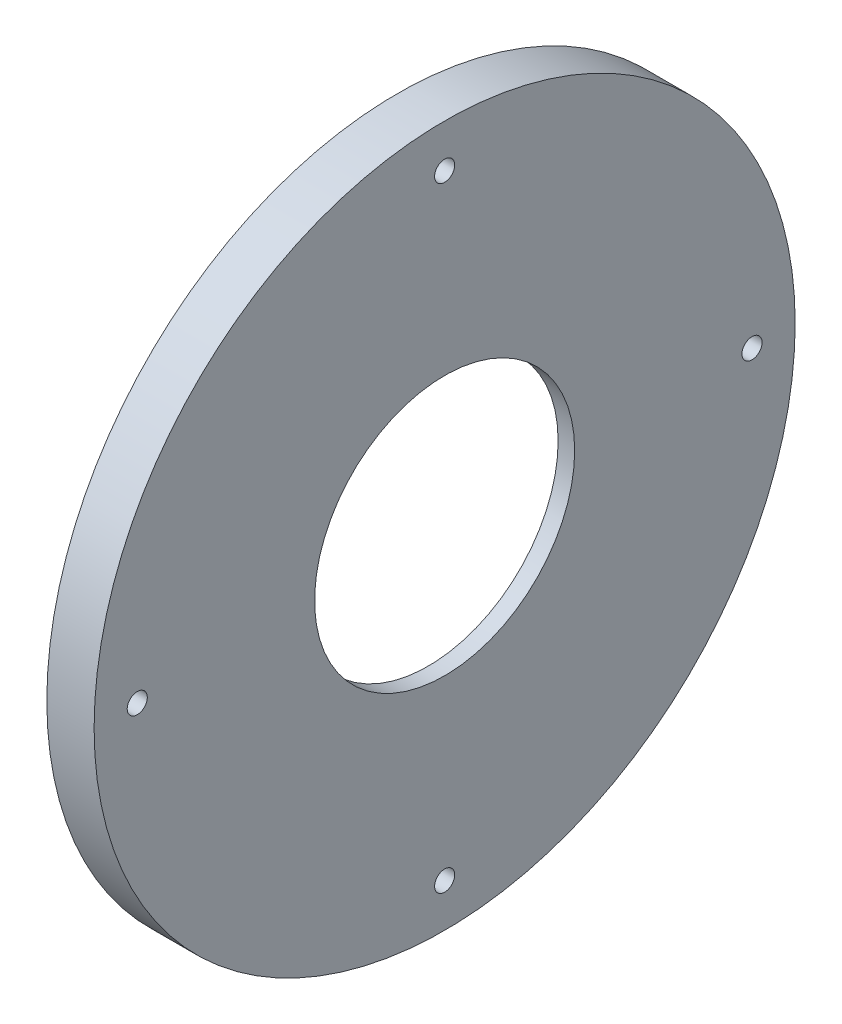
ISO-10303-21;
HEADER;
FILE_DESCRIPTION(('STEP AP214'),'2;1');
FILE_NAME('part.step','',(''),(''),'','','');
FILE_SCHEMA(('AUTOMOTIVE_DESIGN { 1 0 10303 214 1 1 1 1 }'));
ENDSEC;
DATA;
#1=APPLICATION_CONTEXT('core data for automotive mechanical design processes');
#2=APPLICATION_PROTOCOL_DEFINITION('international standard','automotive_design',2000,#1);
#3=PRODUCT_CONTEXT('',#1,'mechanical');
#4=PRODUCT('Part','Part','',(#3));
#5=PRODUCT_RELATED_PRODUCT_CATEGORY('part','',(#4));
#6=PRODUCT_DEFINITION_FORMATION('','',#4);
#7=PRODUCT_DEFINITION_CONTEXT('part definition',#1,'design');
#8=PRODUCT_DEFINITION('design','',#6,#7);
#9=PRODUCT_DEFINITION_SHAPE('','',#8);
#10=(LENGTH_UNIT() NAMED_UNIT(*) SI_UNIT(.MILLI.,.METRE.));
#11=(NAMED_UNIT(*) PLANE_ANGLE_UNIT() SI_UNIT($,.RADIAN.));
#12=(NAMED_UNIT(*) SI_UNIT($,.STERADIAN.) SOLID_ANGLE_UNIT());
#13=UNCERTAINTY_MEASURE_WITH_UNIT(LENGTH_MEASURE(1.E-05),#10,'distance_accuracy_value','');
#14=(GEOMETRIC_REPRESENTATION_CONTEXT(3) GLOBAL_UNCERTAINTY_ASSIGNED_CONTEXT((#13)) GLOBAL_UNIT_ASSIGNED_CONTEXT((#10,
#11,#12)) REPRESENTATION_CONTEXT('',''));
#15=CARTESIAN_POINT('',(0.,0.,0.));
#16=DIRECTION('',(0.,0.,1.));
#17=DIRECTION('',(1.,0.,0.));
#18=AXIS2_PLACEMENT_3D('',#15,#16,#17);
#19=CARTESIAN_POINT('',(387.851746626202,0.,0.));
#20=DIRECTION('',(1.,0.,0.));
#21=DIRECTION('',(0.,0.,-1.));
#22=AXIS2_PLACEMENT_3D('',#19,#20,#21);
#23=CYLINDRICAL_SURFACE('',#22,55.);
#24=CARTESIAN_POINT('',(407.851746626202,0.,0.));
#25=DIRECTION('',(1.,0.,0.));
#26=DIRECTION('',(0.,0.,-1.));
#27=AXIS2_PLACEMENT_3D('',#24,#25,#26);
#28=CIRCLE('',#27,55.);
#29=CARTESIAN_POINT('',(407.851746626202,0.,-55.));
#30=VERTEX_POINT('',#29);
#31=EDGE_CURVE('E57',#30,#30,#28,.T.);
#32=ORIENTED_EDGE('',*,*,#31,.T.);
#33=EDGE_LOOP('',(#32));
#34=FACE_BOUND('',#33,.T.);
#35=CARTESIAN_POINT('',(400.851746626202,0.,0.));
#36=DIRECTION('',(-1.,0.,0.));
#37=DIRECTION('',(0.,0.,1.));
#38=AXIS2_PLACEMENT_3D('',#35,#36,#37);
#39=CIRCLE('',#38,55.);
#40=CARTESIAN_POINT('',(400.851746626202,0.,55.));
#41=VERTEX_POINT('',#40);
#42=EDGE_CURVE('E47',#41,#41,#39,.F.);
#43=ORIENTED_EDGE('',*,*,#42,.F.);
#44=EDGE_LOOP('',(#43));
#45=FACE_BOUND('',#44,.T.);
#46=ADVANCED_FACE('F43',(#34,#45),#23,.F.);
#47=CARTESIAN_POINT('',(22.6723846157029,0.,0.));
#48=DIRECTION('',(-1.,0.,0.));
#49=DIRECTION('',(0.,0.,1.));
#50=AXIS2_PLACEMENT_3D('',#47,#48,#49);
#51=CYLINDRICAL_SURFACE('',#50,148.25);
#52=CARTESIAN_POINT('',(387.851746626202,0.,0.));
#53=DIRECTION('',(-1.,0.,0.));
#54=DIRECTION('',(0.,0.,1.));
#55=AXIS2_PLACEMENT_3D('',#52,#53,#54);
#56=CIRCLE('',#55,148.25);
#57=CARTESIAN_POINT('',(387.851746626202,0.,148.25));
#58=VERTEX_POINT('',#57);
#59=EDGE_CURVE('E10',#58,#58,#56,.T.);
#60=ORIENTED_EDGE('',*,*,#59,.F.);
#61=EDGE_LOOP('',(#60));
#62=FACE_BOUND('',#61,.T.);
#63=CARTESIAN_POINT('',(407.851746626202,0.,0.));
#64=DIRECTION('',(-1.,0.,0.));
#65=DIRECTION('',(0.,0.,1.));
#66=AXIS2_PLACEMENT_3D('',#63,#64,#65);
#67=CIRCLE('',#66,148.25);
#68=CARTESIAN_POINT('',(407.851746626202,0.,148.25));
#69=VERTEX_POINT('',#68);
#70=EDGE_CURVE('E52',#69,#69,#67,.T.);
#71=ORIENTED_EDGE('',*,*,#70,.T.);
#72=EDGE_LOOP('',(#71));
#73=FACE_BOUND('',#72,.T.);
#74=ADVANCED_FACE('F45',(#62,#73),#51,.T.);
#75=CARTESIAN_POINT('',(387.851746626202,1.45228310032206E-13,0.));
#76=DIRECTION('',(1.,0.,0.));
#77=DIRECTION('',(0.,0.,-1.));
#78=AXIS2_PLACEMENT_3D('',#75,#76,#77);
#79=PLANE('',#78);
#80=CARTESIAN_POINT('',(387.851746626202,130.,0.));
#81=DIRECTION('',(-1.,0.,0.));
#82=DIRECTION('',(0.,0.,1.));
#83=AXIS2_PLACEMENT_3D('',#80,#81,#82);
#84=CIRCLE('',#83,4.24999999999998);
#85=CARTESIAN_POINT('',(387.851746626202,130.,4.24999999999998));
#86=VERTEX_POINT('',#85);
#87=EDGE_CURVE('E99',#86,#86,#84,.T.);
#88=ORIENTED_EDGE('',*,*,#87,.F.);
#89=EDGE_LOOP('',(#88));
#90=FACE_BOUND('',#89,.T.);
#91=CARTESIAN_POINT('',(387.851746626202,0.,-130.));
#92=DIRECTION('',(-1.,0.,0.));
#93=DIRECTION('',(0.,0.,1.));
#94=AXIS2_PLACEMENT_3D('',#91,#92,#93);
#95=CIRCLE('',#94,4.24999999999999);
#96=CARTESIAN_POINT('',(387.851746626202,0.,-125.75));
#97=VERTEX_POINT('',#96);
#98=EDGE_CURVE('E91',#97,#97,#95,.T.);
#99=ORIENTED_EDGE('',*,*,#98,.F.);
#100=EDGE_LOOP('',(#99));
#101=FACE_BOUND('',#100,.T.);
#102=CARTESIAN_POINT('',(387.851746626202,-130.,0.));
#103=DIRECTION('',(-1.,0.,0.));
#104=DIRECTION('',(0.,0.,1.));
#105=AXIS2_PLACEMENT_3D('',#102,#103,#104);
#106=CIRCLE('',#105,4.24999999999998);
#107=CARTESIAN_POINT('',(387.851746626202,-130.,4.24999999999998));
#108=VERTEX_POINT('',#107);
#109=EDGE_CURVE('E83',#108,#108,#106,.T.);
#110=ORIENTED_EDGE('',*,*,#109,.F.);
#111=EDGE_LOOP('',(#110));
#112=FACE_BOUND('',#111,.T.);
#113=CARTESIAN_POINT('',(387.851746626202,0.,130.));
#114=DIRECTION('',(-1.,0.,0.));
#115=DIRECTION('',(0.,0.,1.));
#116=AXIS2_PLACEMENT_3D('',#113,#114,#115);
#117=CIRCLE('',#116,4.24999999999999);
#118=CARTESIAN_POINT('',(387.851746626202,0.,134.25));
#119=VERTEX_POINT('',#118);
#120=EDGE_CURVE('E75',#119,#119,#117,.T.);
#121=ORIENTED_EDGE('',*,*,#120,.F.);
#122=EDGE_LOOP('',(#121));
#123=FACE_BOUND('',#122,.T.);
#124=CARTESIAN_POINT('',(387.851746626202,0.,0.));
#125=DIRECTION('',(-1.,0.,0.));
#126=DIRECTION('',(0.,0.,1.));
#127=AXIS2_PLACEMENT_3D('',#124,#125,#126);
#128=CIRCLE('',#127,87.637601459645);
#129=CARTESIAN_POINT('',(387.851746626202,0.,87.637601459645));
#130=VERTEX_POINT('',#129);
#131=EDGE_CURVE('E63',#130,#130,#128,.T.);
#132=ORIENTED_EDGE('',*,*,#131,.F.);
#133=EDGE_LOOP('',(#132));
#134=FACE_BOUND('',#133,.T.);
#135=ORIENTED_EDGE('',*,*,#59,.T.);
#136=EDGE_LOOP('',(#135));
#137=FACE_BOUND('',#136,.T.);
#138=ADVANCED_FACE('F106',(#90,#101,#112,#123,#134,#137),#79,.F.);
#139=CARTESIAN_POINT('',(407.851746626202,0.,0.));
#140=DIRECTION('',(-1.,0.,0.));
#141=DIRECTION('',(0.,0.,1.));
#142=AXIS2_PLACEMENT_3D('',#139,#140,#141);
#143=PLANE('',#142);
#144=CARTESIAN_POINT('',(407.851746626202,130.,0.));
#145=DIRECTION('',(-1.,0.,0.));
#146=DIRECTION('',(0.,0.,1.));
#147=AXIS2_PLACEMENT_3D('',#144,#145,#146);
#148=CIRCLE('',#147,4.25);
#149=CARTESIAN_POINT('',(407.851746626202,130.,4.25));
#150=VERTEX_POINT('',#149);
#151=EDGE_CURVE('E95',#150,#150,#148,.T.);
#152=ORIENTED_EDGE('',*,*,#151,.T.);
#153=EDGE_LOOP('',(#152));
#154=FACE_BOUND('',#153,.T.);
#155=CARTESIAN_POINT('',(407.851746626202,0.,-130.));
#156=DIRECTION('',(-1.,0.,0.));
#157=DIRECTION('',(0.,0.,1.));
#158=AXIS2_PLACEMENT_3D('',#155,#156,#157);
#159=CIRCLE('',#158,4.24999999999999);
#160=CARTESIAN_POINT('',(407.851746626202,0.,-125.75));
#161=VERTEX_POINT('',#160);
#162=EDGE_CURVE('E87',#161,#161,#159,.T.);
#163=ORIENTED_EDGE('',*,*,#162,.T.);
#164=EDGE_LOOP('',(#163));
#165=FACE_BOUND('',#164,.T.);
#166=CARTESIAN_POINT('',(407.851746626202,-130.,0.));
#167=DIRECTION('',(-1.,0.,0.));
#168=DIRECTION('',(0.,0.,1.));
#169=AXIS2_PLACEMENT_3D('',#166,#167,#168);
#170=CIRCLE('',#169,4.25);
#171=CARTESIAN_POINT('',(407.851746626202,-130.,4.25));
#172=VERTEX_POINT('',#171);
#173=EDGE_CURVE('E79',#172,#172,#170,.T.);
#174=ORIENTED_EDGE('',*,*,#173,.T.);
#175=EDGE_LOOP('',(#174));
#176=FACE_BOUND('',#175,.T.);
#177=CARTESIAN_POINT('',(407.851746626202,0.,130.));
#178=DIRECTION('',(-1.,0.,0.));
#179=DIRECTION('',(0.,0.,1.));
#180=AXIS2_PLACEMENT_3D('',#177,#178,#179);
#181=CIRCLE('',#180,4.24999999999999);
#182=CARTESIAN_POINT('',(407.851746626202,0.,134.25));
#183=VERTEX_POINT('',#182);
#184=EDGE_CURVE('E68',#183,#183,#181,.T.);
#185=ORIENTED_EDGE('',*,*,#184,.T.);
#186=EDGE_LOOP('',(#185));
#187=FACE_BOUND('',#186,.T.);
#188=ORIENTED_EDGE('',*,*,#31,.F.);
#189=EDGE_LOOP('',(#188));
#190=FACE_BOUND('',#189,.T.);
#191=ORIENTED_EDGE('',*,*,#70,.F.);
#192=EDGE_LOOP('',(#191));
#193=FACE_BOUND('',#192,.T.);
#194=ADVANCED_FACE('F109',(#154,#165,#176,#187,#190,#193),#143,.F.);
#195=CARTESIAN_POINT('',(400.851746626202,0.,0.));
#196=DIRECTION('',(-1.,0.,0.));
#197=DIRECTION('',(0.,0.,1.));
#198=AXIS2_PLACEMENT_3D('',#195,#196,#197);
#199=PLANE('',#198);
#200=CARTESIAN_POINT('',(400.851746626202,0.,0.));
#201=DIRECTION('',(-1.,0.,0.));
#202=DIRECTION('',(0.,0.,1.));
#203=AXIS2_PLACEMENT_3D('',#200,#201,#202);
#204=CIRCLE('',#203,87.637601459645);
#205=CARTESIAN_POINT('',(400.851746626202,0.,87.637601459645));
#206=VERTEX_POINT('',#205);
#207=EDGE_CURVE('E67',#206,#206,#204,.T.);
#208=ORIENTED_EDGE('',*,*,#207,.T.);
#209=EDGE_LOOP('',(#208));
#210=FACE_BOUND('',#209,.T.);
#211=ORIENTED_EDGE('',*,*,#42,.T.);
#212=EDGE_LOOP('',(#211));
#213=FACE_BOUND('',#212,.T.);
#214=ADVANCED_FACE('F121',(#210,#213),#199,.T.);
#215=CARTESIAN_POINT('',(400.851746626202,0.,0.));
#216=DIRECTION('',(-1.,0.,0.));
#217=DIRECTION('',(0.,0.,1.));
#218=AXIS2_PLACEMENT_3D('',#215,#216,#217);
#219=CYLINDRICAL_SURFACE('',#218,87.637601459645);
#220=CARTESIAN_POINT('',(400.851746626202,0.,87.637601459645));
#221=CARTESIAN_POINT('',(400.716329959536,0.,87.637601459645));
#222=CARTESIAN_POINT('',(400.580913292869,0.,87.637601459645));
#223=CARTESIAN_POINT('',(400.310079959536,0.,87.637601459645));
#224=CARTESIAN_POINT('',(400.174663292869,0.,87.637601459645));
#225=CARTESIAN_POINT('',(399.903829959536,0.,87.637601459645));
#226=CARTESIAN_POINT('',(399.768413292869,0.,87.637601459645));
#227=CARTESIAN_POINT('',(399.497579959536,0.,87.637601459645));
#228=CARTESIAN_POINT('',(399.362163292869,0.,87.637601459645));
#229=CARTESIAN_POINT('',(399.091329959536,0.,87.637601459645));
#230=CARTESIAN_POINT('',(398.955913292869,0.,87.637601459645));
#231=CARTESIAN_POINT('',(398.685079959536,0.,87.637601459645));
#232=CARTESIAN_POINT('',(398.549663292869,0.,87.637601459645));
#233=CARTESIAN_POINT('',(398.278829959536,0.,87.637601459645));
#234=CARTESIAN_POINT('',(398.143413292869,0.,87.637601459645));
#235=CARTESIAN_POINT('',(397.872579959536,0.,87.637601459645));
#236=CARTESIAN_POINT('',(397.737163292869,0.,87.637601459645));
#237=CARTESIAN_POINT('',(397.466329959536,0.,87.637601459645));
#238=CARTESIAN_POINT('',(397.330913292869,0.,87.637601459645));
#239=CARTESIAN_POINT('',(397.060079959536,0.,87.637601459645));
#240=CARTESIAN_POINT('',(396.924663292869,0.,87.637601459645));
#241=CARTESIAN_POINT('',(396.653829959536,0.,87.637601459645));
#242=CARTESIAN_POINT('',(396.518413292869,0.,87.637601459645));
#243=CARTESIAN_POINT('',(396.247579959536,0.,87.637601459645));
#244=CARTESIAN_POINT('',(396.112163292869,0.,87.637601459645));
#245=CARTESIAN_POINT('',(395.841329959536,0.,87.637601459645));
#246=CARTESIAN_POINT('',(395.705913292869,0.,87.637601459645));
#247=CARTESIAN_POINT('',(395.435079959536,0.,87.637601459645));
#248=CARTESIAN_POINT('',(395.299663292869,0.,87.637601459645));
#249=CARTESIAN_POINT('',(395.028829959536,0.,87.637601459645));
#250=CARTESIAN_POINT('',(394.893413292869,0.,87.637601459645));
#251=CARTESIAN_POINT('',(394.622579959536,0.,87.637601459645));
#252=CARTESIAN_POINT('',(394.487163292869,0.,87.637601459645));
#253=CARTESIAN_POINT('',(394.216329959536,0.,87.637601459645));
#254=CARTESIAN_POINT('',(394.080913292869,0.,87.637601459645));
#255=CARTESIAN_POINT('',(393.810079959536,0.,87.637601459645));
#256=CARTESIAN_POINT('',(393.674663292869,0.,87.637601459645));
#257=CARTESIAN_POINT('',(393.403829959536,0.,87.637601459645));
#258=CARTESIAN_POINT('',(393.268413292869,0.,87.637601459645));
#259=CARTESIAN_POINT('',(392.997579959536,0.,87.637601459645));
#260=CARTESIAN_POINT('',(392.862163292869,0.,87.637601459645));
#261=CARTESIAN_POINT('',(392.591329959536,0.,87.637601459645));
#262=CARTESIAN_POINT('',(392.455913292869,0.,87.637601459645));
#263=CARTESIAN_POINT('',(392.185079959536,0.,87.637601459645));
#264=CARTESIAN_POINT('',(392.049663292869,0.,87.637601459645));
#265=CARTESIAN_POINT('',(391.778829959536,0.,87.637601459645));
#266=CARTESIAN_POINT('',(391.643413292869,0.,87.637601459645));
#267=CARTESIAN_POINT('',(391.372579959536,0.,87.637601459645));
#268=CARTESIAN_POINT('',(391.237163292869,0.,87.637601459645));
#269=CARTESIAN_POINT('',(390.966329959536,0.,87.637601459645));
#270=CARTESIAN_POINT('',(390.830913292869,0.,87.637601459645));
#271=CARTESIAN_POINT('',(390.560079959536,0.,87.637601459645));
#272=CARTESIAN_POINT('',(390.424663292869,0.,87.637601459645));
#273=CARTESIAN_POINT('',(390.153829959536,0.,87.637601459645));
#274=CARTESIAN_POINT('',(390.018413292869,0.,87.637601459645));
#275=CARTESIAN_POINT('',(389.747579959536,0.,87.637601459645));
#276=CARTESIAN_POINT('',(389.612163292869,0.,87.637601459645));
#277=CARTESIAN_POINT('',(389.341329959536,0.,87.637601459645));
#278=CARTESIAN_POINT('',(389.205913292869,0.,87.637601459645));
#279=CARTESIAN_POINT('',(388.935079959536,0.,87.637601459645));
#280=CARTESIAN_POINT('',(388.799663292869,0.,87.637601459645));
#281=CARTESIAN_POINT('',(388.528829959536,0.,87.637601459645));
#282=CARTESIAN_POINT('',(388.393413292869,0.,87.637601459645));
#283=CARTESIAN_POINT('',(388.122579959536,0.,87.637601459645));
#284=CARTESIAN_POINT('',(387.987163292869,0.,87.637601459645));
#285=CARTESIAN_POINT('',(387.851746626202,0.,87.637601459645));
#286=B_SPLINE_CURVE_WITH_KNOTS('',3,(#220,#221,#222,#223,#224,#225,#226,#227,#228,#229,#230,
#231,#232,#233,#234,#235,#236,#237,#238,#239,#240,#241,#242,#243,#244,#245,#246,#247,#248,#249,
#250,#251,#252,#253,#254,#255,#256,#257,#258,#259,#260,#261,#262,#263,#264,#265,#266,#267,#268,
#269,#270,#271,#272,#273,#274,#275,#276,#277,#278,#279,#280,#281,#282,#283,#284,#285),
.UNSPECIFIED.,.F.,.F.,(4,2,2,2,2,2,2,2,2,2,2,2,2,2,2,2,2,2,2,2,2,2,2,2,2,2,2,2,2,2,2,2,4),(0.,
0.406249999999997,0.812499999999994,1.21874999999999,1.62499999999999,2.03124999999998,
2.43749999999998,2.84374999999998,3.24999999999998,3.65624999999997,4.06249999999997,
4.46874999999997,4.87499999999996,5.28124999999996,5.68749999999996,6.09374999999995,
6.49999999999995,6.90625,7.3125,7.71875,8.12499999999999,8.53124999999999,8.93749999999999,
9.34374999999998,9.74999999999998,10.15625,10.5625,10.96875,11.375,11.78125,12.1875,12.59375,
13.),.UNSPECIFIED.);
#287=EDGE_CURVE('BSEAM118',#206,#130,#286,.T.);
#288=ORIENTED_EDGE('',*,*,#207,.F.);
#289=ORIENTED_EDGE('',*,*,#131,.T.);
#290=ORIENTED_EDGE('',*,*,#287,.T.);
#291=ORIENTED_EDGE('',*,*,#287,.F.);
#292=EDGE_LOOP('',(#288,#290,#289,#291));
#293=FACE_BOUND('',#292,.T.);
#294=ADVANCED_FACE('F118',(#293),#219,.F.);
#295=CARTESIAN_POINT('',(387.851746626202,0.,130.));
#296=DIRECTION('',(-1.,0.,0.));
#297=DIRECTION('',(0.,0.,1.));
#298=AXIS2_PLACEMENT_3D('',#295,#296,#297);
#299=CYLINDRICAL_SURFACE('',#298,4.24999999999999);
#300=ORIENTED_EDGE('',*,*,#184,.F.);
#301=EDGE_LOOP('',(#300));
#302=FACE_BOUND('',#301,.T.);
#303=ORIENTED_EDGE('',*,*,#120,.T.);
#304=EDGE_LOOP('',(#303));
#305=FACE_BOUND('',#304,.T.);
#306=ADVANCED_FACE('F120',(#302,#305),#299,.F.);
#307=CARTESIAN_POINT('',(387.851746626202,-130.,0.));
#308=DIRECTION('',(-1.,0.,0.));
#309=DIRECTION('',(0.,0.,1.));
#310=AXIS2_PLACEMENT_3D('',#307,#308,#309);
#311=CYLINDRICAL_SURFACE('',#310,4.24999999999999);
#312=ORIENTED_EDGE('',*,*,#173,.F.);
#313=EDGE_LOOP('',(#312));
#314=FACE_BOUND('',#313,.T.);
#315=ORIENTED_EDGE('',*,*,#109,.T.);
#316=EDGE_LOOP('',(#315));
#317=FACE_BOUND('',#316,.T.);
#318=ADVANCED_FACE('F128',(#314,#317),#311,.F.);
#319=CARTESIAN_POINT('',(387.851746626202,0.,-130.));
#320=DIRECTION('',(-1.,0.,0.));
#321=DIRECTION('',(0.,0.,1.));
#322=AXIS2_PLACEMENT_3D('',#319,#320,#321);
#323=CYLINDRICAL_SURFACE('',#322,4.24999999999999);
#324=ORIENTED_EDGE('',*,*,#162,.F.);
#325=EDGE_LOOP('',(#324));
#326=FACE_BOUND('',#325,.T.);
#327=ORIENTED_EDGE('',*,*,#98,.T.);
#328=EDGE_LOOP('',(#327));
#329=FACE_BOUND('',#328,.T.);
#330=ADVANCED_FACE('F163',(#326,#329),#323,.F.);
#331=CARTESIAN_POINT('',(387.851746626202,130.,0.));
#332=DIRECTION('',(-1.,0.,0.));
#333=DIRECTION('',(0.,0.,1.));
#334=AXIS2_PLACEMENT_3D('',#331,#332,#333);
#335=CYLINDRICAL_SURFACE('',#334,4.24999999999999);
#336=ORIENTED_EDGE('',*,*,#151,.F.);
#337=EDGE_LOOP('',(#336));
#338=FACE_BOUND('',#337,.T.);
#339=ORIENTED_EDGE('',*,*,#87,.T.);
#340=EDGE_LOOP('',(#339));
#341=FACE_BOUND('',#340,.T.);
#342=ADVANCED_FACE('F104',(#338,#341),#335,.F.);
#343=CLOSED_SHELL('',(#46,#74,#138,#194,#214,#294,#306,#318,#330,#342));
#344=MANIFOLD_SOLID_BREP('B2',#343);
#345=ADVANCED_BREP_SHAPE_REPRESENTATION('',(#18,#344),#14);
#346=SHAPE_DEFINITION_REPRESENTATION(#9,#345);
ENDSEC;
END-ISO-10303-21;
